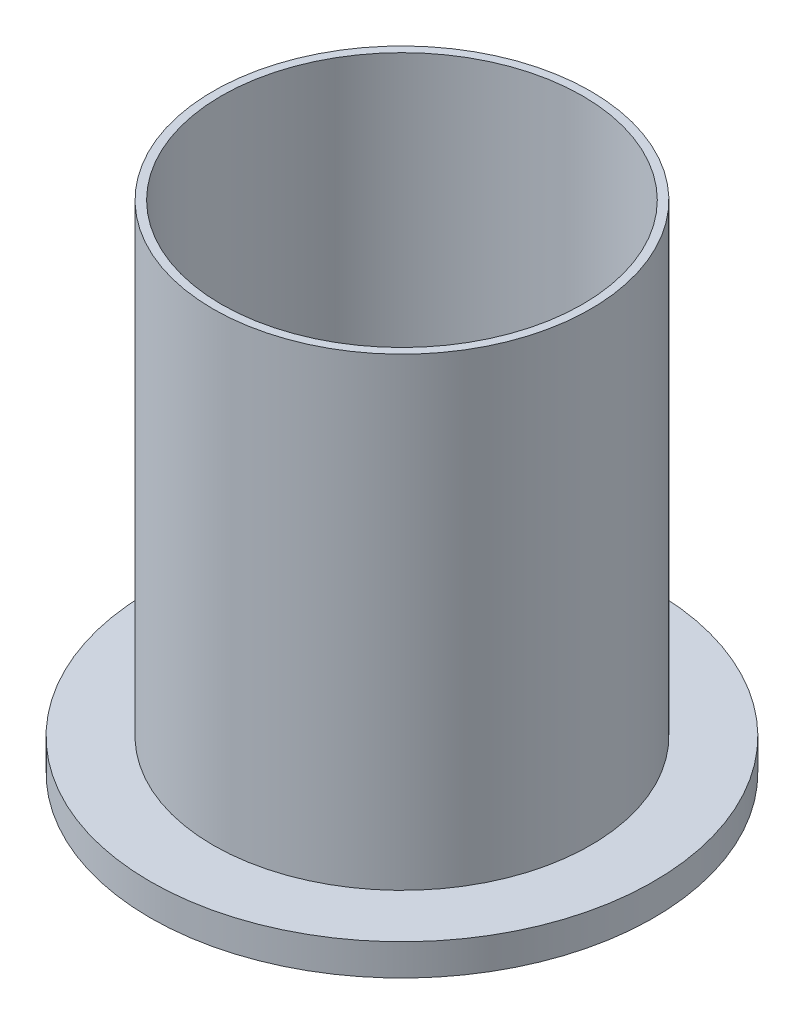
ISO-10303-21;
HEADER;
FILE_DESCRIPTION(('STEP AP214'),'2;1');
FILE_NAME('part.step','',(''),(''),'','','');
FILE_SCHEMA(('AUTOMOTIVE_DESIGN { 1 0 10303 214 1 1 1 1 }'));
ENDSEC;
DATA;
#1=APPLICATION_CONTEXT('core data for automotive mechanical design processes');
#2=APPLICATION_PROTOCOL_DEFINITION('international standard','automotive_design',2000,#1);
#3=PRODUCT_CONTEXT('',#1,'mechanical');
#4=PRODUCT('Part','Part','',(#3));
#5=PRODUCT_RELATED_PRODUCT_CATEGORY('part','',(#4));
#6=PRODUCT_DEFINITION_FORMATION('','',#4);
#7=PRODUCT_DEFINITION_CONTEXT('part definition',#1,'design');
#8=PRODUCT_DEFINITION('design','',#6,#7);
#9=PRODUCT_DEFINITION_SHAPE('','',#8);
#10=(LENGTH_UNIT() NAMED_UNIT(*) SI_UNIT(.MILLI.,.METRE.));
#11=(NAMED_UNIT(*) PLANE_ANGLE_UNIT() SI_UNIT($,.RADIAN.));
#12=(NAMED_UNIT(*) SI_UNIT($,.STERADIAN.) SOLID_ANGLE_UNIT());
#13=UNCERTAINTY_MEASURE_WITH_UNIT(LENGTH_MEASURE(1.E-05),#10,'distance_accuracy_value','');
#14=(GEOMETRIC_REPRESENTATION_CONTEXT(3) GLOBAL_UNCERTAINTY_ASSIGNED_CONTEXT((#13)) GLOBAL_UNIT_ASSIGNED_CONTEXT((#10,
#11,#12)) REPRESENTATION_CONTEXT('',''));
#15=CARTESIAN_POINT('',(0.,0.,0.));
#16=DIRECTION('',(0.,0.,1.));
#17=DIRECTION('',(1.,0.,0.));
#18=AXIS2_PLACEMENT_3D('',#15,#16,#17);
#19=CARTESIAN_POINT('',(0.,100.076,0.));
#20=DIRECTION('',(0.,-1.,0.));
#21=DIRECTION('',(0.,0.,-1.));
#22=AXIS2_PLACEMENT_3D('',#19,#20,#21);
#23=CYLINDRICAL_SURFACE('',#22,36.449);
#24=CARTESIAN_POINT('',(0.,100.076,0.));
#25=DIRECTION('',(0.,1.,0.));
#26=DIRECTION('',(0.,0.,1.));
#27=AXIS2_PLACEMENT_3D('',#24,#25,#26);
#28=CIRCLE('',#27,36.449);
#29=CARTESIAN_POINT('',(0.,100.076,36.449));
#30=VERTEX_POINT('',#29);
#31=EDGE_CURVE('E40',#30,#30,#28,.T.);
#32=ORIENTED_EDGE('',*,*,#31,.T.);
#33=EDGE_LOOP('',(#32));
#34=FACE_BOUND('',#33,.T.);
#35=CARTESIAN_POINT('',(0.,0.,0.));
#36=DIRECTION('',(0.,1.,0.));
#37=DIRECTION('',(0.,0.,1.));
#38=AXIS2_PLACEMENT_3D('',#35,#36,#37);
#39=CIRCLE('',#38,36.449);
#40=CARTESIAN_POINT('',(0.,0.,36.449));
#41=VERTEX_POINT('',#40);
#42=EDGE_CURVE('E36',#41,#41,#39,.T.);
#43=ORIENTED_EDGE('',*,*,#42,.F.);
#44=EDGE_LOOP('',(#43));
#45=FACE_BOUND('',#44,.T.);
#46=ADVANCED_FACE('F33',(#34,#45),#23,.F.);
#47=CARTESIAN_POINT('',(0.,100.076,0.));
#48=DIRECTION('',(0.,-1.,0.));
#49=DIRECTION('',(0.,0.,-1.));
#50=AXIS2_PLACEMENT_3D('',#47,#48,#49);
#51=CYLINDRICAL_SURFACE('',#50,38.1);
#52=CARTESIAN_POINT('',(0.,6.35,0.));
#53=DIRECTION('',(0.,1.,0.));
#54=DIRECTION('',(0.,0.,1.));
#55=AXIS2_PLACEMENT_3D('',#52,#53,#54);
#56=CIRCLE('',#55,38.1);
#57=CARTESIAN_POINT('',(0.,6.35,38.1));
#58=VERTEX_POINT('',#57);
#59=EDGE_CURVE('E49',#58,#58,#56,.T.);
#60=ORIENTED_EDGE('',*,*,#59,.T.);
#61=EDGE_LOOP('',(#60));
#62=FACE_BOUND('',#61,.T.);
#63=CARTESIAN_POINT('',(0.,100.076,0.));
#64=DIRECTION('',(0.,1.,0.));
#65=DIRECTION('',(0.,0.,1.));
#66=AXIS2_PLACEMENT_3D('',#63,#64,#65);
#67=CIRCLE('',#66,38.1);
#68=CARTESIAN_POINT('',(0.,100.076,38.1));
#69=VERTEX_POINT('',#68);
#70=EDGE_CURVE('E10',#69,#69,#67,.T.);
#71=ORIENTED_EDGE('',*,*,#70,.F.);
#72=EDGE_LOOP('',(#71));
#73=FACE_BOUND('',#72,.T.);
#74=ADVANCED_FACE('F56',(#62,#73),#51,.T.);
#75=CARTESIAN_POINT('',(0.,100.076,0.));
#76=DIRECTION('',(0.,1.,0.));
#77=DIRECTION('',(0.,0.,1.));
#78=AXIS2_PLACEMENT_3D('',#75,#76,#77);
#79=PLANE('',#78);
#80=ORIENTED_EDGE('',*,*,#31,.F.);
#81=EDGE_LOOP('',(#80));
#82=FACE_BOUND('',#81,.T.);
#83=ORIENTED_EDGE('',*,*,#70,.T.);
#84=EDGE_LOOP('',(#83));
#85=FACE_BOUND('',#84,.T.);
#86=ADVANCED_FACE('F73',(#82,#85),#79,.T.);
#87=CARTESIAN_POINT('',(0.,0.,0.));
#88=DIRECTION('',(0.,1.,0.));
#89=DIRECTION('',(0.,0.,1.));
#90=AXIS2_PLACEMENT_3D('',#87,#88,#89);
#91=PLANE('',#90);
#92=ORIENTED_EDGE('',*,*,#42,.T.);
#93=EDGE_LOOP('',(#92));
#94=FACE_BOUND('',#93,.T.);
#95=CARTESIAN_POINT('',(0.,0.,0.));
#96=DIRECTION('',(0.,1.,0.));
#97=DIRECTION('',(0.,0.,1.));
#98=AXIS2_PLACEMENT_3D('',#95,#96,#97);
#99=CIRCLE('',#98,50.8);
#100=CARTESIAN_POINT('',(0.,0.,50.8));
#101=VERTEX_POINT('',#100);
#102=EDGE_CURVE('E46',#101,#101,#99,.T.);
#103=ORIENTED_EDGE('',*,*,#102,.F.);
#104=EDGE_LOOP('',(#103));
#105=FACE_BOUND('',#104,.T.);
#106=ADVANCED_FACE('F68',(#94,#105),#91,.F.);
#107=CARTESIAN_POINT('',(0.,6.35,0.));
#108=DIRECTION('',(0.,-1.,0.));
#109=DIRECTION('',(0.,0.,-1.));
#110=AXIS2_PLACEMENT_3D('',#107,#108,#109);
#111=CYLINDRICAL_SURFACE('',#110,50.8);
#112=CARTESIAN_POINT('',(0.,6.35,0.));
#113=DIRECTION('',(0.,1.,0.));
#114=DIRECTION('',(0.,0.,1.));
#115=AXIS2_PLACEMENT_3D('',#112,#113,#114);
#116=CIRCLE('',#115,50.8);
#117=CARTESIAN_POINT('',(0.,6.35,50.8));
#118=VERTEX_POINT('',#117);
#119=EDGE_CURVE('E50',#118,#118,#116,.T.);
#120=ORIENTED_EDGE('',*,*,#119,.F.);
#121=EDGE_LOOP('',(#120));
#122=FACE_BOUND('',#121,.T.);
#123=ORIENTED_EDGE('',*,*,#102,.T.);
#124=EDGE_LOOP('',(#123));
#125=FACE_BOUND('',#124,.T.);
#126=ADVANCED_FACE('F62',(#122,#125),#111,.T.);
#127=CARTESIAN_POINT('',(0.,6.35,0.));
#128=DIRECTION('',(0.,1.,0.));
#129=DIRECTION('',(0.,0.,1.));
#130=AXIS2_PLACEMENT_3D('',#127,#128,#129);
#131=PLANE('',#130);
#132=ORIENTED_EDGE('',*,*,#59,.F.);
#133=EDGE_LOOP('',(#132));
#134=FACE_BOUND('',#133,.T.);
#135=ORIENTED_EDGE('',*,*,#119,.T.);
#136=EDGE_LOOP('',(#135));
#137=FACE_BOUND('',#136,.T.);
#138=ADVANCED_FACE('F59',(#134,#137),#131,.T.);
#139=CLOSED_SHELL('',(#46,#74,#86,#106,#126,#138));
#140=MANIFOLD_SOLID_BREP('B2',#139);
#141=ADVANCED_BREP_SHAPE_REPRESENTATION('',(#18,#140),#14);
#142=SHAPE_DEFINITION_REPRESENTATION(#9,#141);
ENDSEC;
END-ISO-10303-21;
